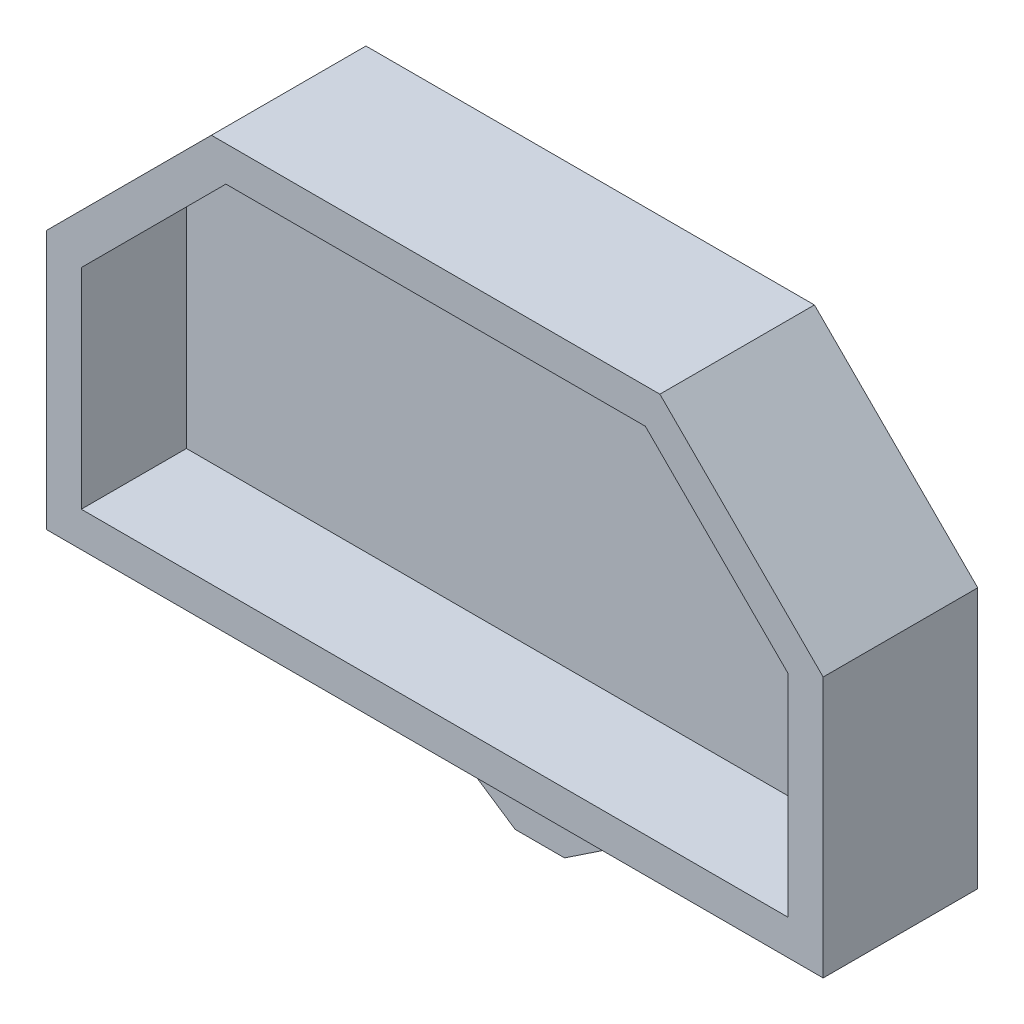
ISO-10303-21;
HEADER;
FILE_DESCRIPTION(('STEP AP214'),'2;1');
FILE_NAME('part.step','',(''),(''),'','','');
FILE_SCHEMA(('AUTOMOTIVE_DESIGN { 1 0 10303 214 1 1 1 1 }'));
ENDSEC;
DATA;
#1=APPLICATION_CONTEXT('core data for automotive mechanical design processes');
#2=APPLICATION_PROTOCOL_DEFINITION('international standard','automotive_design',2000,#1);
#3=PRODUCT_CONTEXT('',#1,'mechanical');
#4=PRODUCT('Part','Part','',(#3));
#5=PRODUCT_RELATED_PRODUCT_CATEGORY('part','',(#4));
#6=PRODUCT_DEFINITION_FORMATION('','',#4);
#7=PRODUCT_DEFINITION_CONTEXT('part definition',#1,'design');
#8=PRODUCT_DEFINITION('design','',#6,#7);
#9=PRODUCT_DEFINITION_SHAPE('','',#8);
#10=(LENGTH_UNIT() NAMED_UNIT(*) SI_UNIT(.MILLI.,.METRE.));
#11=(NAMED_UNIT(*) PLANE_ANGLE_UNIT() SI_UNIT($,.RADIAN.));
#12=(NAMED_UNIT(*) SI_UNIT($,.STERADIAN.) SOLID_ANGLE_UNIT());
#13=UNCERTAINTY_MEASURE_WITH_UNIT(LENGTH_MEASURE(1.E-05),#10,'distance_accuracy_value','');
#14=(GEOMETRIC_REPRESENTATION_CONTEXT(3) GLOBAL_UNCERTAINTY_ASSIGNED_CONTEXT((#13)) GLOBAL_UNIT_ASSIGNED_CONTEXT((#10,
#11,#12)) REPRESENTATION_CONTEXT('',''));
#15=CARTESIAN_POINT('',(0.,0.,0.));
#16=DIRECTION('',(0.,0.,1.));
#17=DIRECTION('',(1.,0.,0.));
#18=AXIS2_PLACEMENT_3D('',#15,#16,#17);
#19=CARTESIAN_POINT('',(10.6544551132229,-2.54,-7.62));
#20=DIRECTION('',(0.,1.,0.));
#21=DIRECTION('',(0.,0.,1.));
#22=AXIS2_PLACEMENT_3D('',#19,#20,#21);
#23=PLANE('',#22);
#24=DIRECTION('',(0.,0.,-1.));
#25=VECTOR('',#24,1.);
#26=CARTESIAN_POINT('',(37.0172951660761,-2.54,-7.62));
#27=LINE('',#26,#25);
#28=CARTESIAN_POINT('',(37.0172951660761,-2.54,-7.62));
#29=VERTEX_POINT('',#28);
#30=CARTESIAN_POINT('',(37.0172951660761,-2.54,-11.2014));
#31=VERTEX_POINT('',#30);
#32=EDGE_CURVE('E181',#29,#31,#27,.T.);
#33=ORIENTED_EDGE('',*,*,#32,.F.);
#34=DIRECTION('',(1.,0.,0.));
#35=VECTOR('',#34,1.);
#36=CARTESIAN_POINT('',(40.5986951660761,-2.54,-7.62));
#37=LINE('',#36,#35);
#38=CARTESIAN_POINT('',(40.5986951660761,-2.54,-7.62));
#39=VERTEX_POINT('',#38);
#40=EDGE_CURVE('E192',#29,#39,#37,.T.);
#41=ORIENTED_EDGE('',*,*,#40,.T.);
#42=DIRECTION('',(0.,0.,-1.));
#43=VECTOR('',#42,1.);
#44=CARTESIAN_POINT('',(40.5986951660761,-2.54,-7.62));
#45=LINE('',#44,#43);
#46=CARTESIAN_POINT('',(40.5986951660761,-2.54,-11.2014));
#47=VERTEX_POINT('',#46);
#48=EDGE_CURVE('E238',#39,#47,#45,.T.);
#49=ORIENTED_EDGE('',*,*,#48,.T.);
#50=DIRECTION('',(-1.,0.,0.));
#51=VECTOR('',#50,1.);
#52=CARTESIAN_POINT('',(10.6544551132229,-2.54,-11.2014));
#53=LINE('',#52,#51);
#54=CARTESIAN_POINT('',(66.9615352189293,-2.54,-11.2014));
#55=VERTEX_POINT('',#54);
#56=EDGE_CURVE('E241',#55,#47,#53,.T.);
#57=ORIENTED_EDGE('',*,*,#56,.F.);
#58=DIRECTION('',(0.,0.,1.));
#59=VECTOR('',#58,1.);
#60=CARTESIAN_POINT('',(66.9615352189293,-2.54,-7.62));
#61=LINE('',#60,#59);
#62=CARTESIAN_POINT('',(66.9615352189293,-2.54,0.));
#63=VERTEX_POINT('',#62);
#64=EDGE_CURVE('E318',#55,#63,#61,.T.);
#65=ORIENTED_EDGE('',*,*,#64,.T.);
#66=DIRECTION('',(-1.,0.,0.));
#67=VECTOR('',#66,1.);
#68=CARTESIAN_POINT('',(10.6544551132229,-2.54,0.));
#69=LINE('',#68,#67);
#70=CARTESIAN_POINT('',(10.6544551132229,-2.54,0.));
#71=VERTEX_POINT('',#70);
#72=EDGE_CURVE('E305',#63,#71,#69,.T.);
#73=ORIENTED_EDGE('',*,*,#72,.T.);
#74=DIRECTION('',(0.,0.,1.));
#75=VECTOR('',#74,1.);
#76=CARTESIAN_POINT('',(10.6544551132229,-2.54,-7.62));
#77=LINE('',#76,#75);
#78=CARTESIAN_POINT('',(10.6544551132229,-2.54,-11.2014));
#79=VERTEX_POINT('',#78);
#80=EDGE_CURVE('E11',#79,#71,#77,.T.);
#81=ORIENTED_EDGE('',*,*,#80,.F.);
#82=EDGE_CURVE('E229',#31,#79,#53,.T.);
#83=ORIENTED_EDGE('',*,*,#82,.F.);
#84=EDGE_LOOP('',(#33,#41,#49,#57,#65,#73,#81,#83));
#85=FACE_BOUND('',#84,.T.);
#86=ADVANCED_FACE('F32',(#85),#23,.F.);
#87=CARTESIAN_POINT('',(0.,0.,0.));
#88=DIRECTION('',(0.,0.,1.));
#89=DIRECTION('',(1.,0.,0.));
#90=AXIS2_PLACEMENT_3D('',#87,#88,#89);
#91=PLANE('',#90);
#92=ORIENTED_EDGE('',*,*,#72,.F.);
#93=DIRECTION('',(0.,-1.,0.));
#94=VECTOR('',#93,1.);
#95=CARTESIAN_POINT('',(66.9615352189293,-2.54,0.));
#96=LINE('',#95,#94);
#97=CARTESIAN_POINT('',(66.9615352189293,16.3516632055388,0.));
#98=VERTEX_POINT('',#97);
#99=EDGE_CURVE('E316',#98,#63,#96,.T.);
#100=ORIENTED_EDGE('',*,*,#99,.F.);
#101=DIRECTION('',(0.707106781186548,-0.707106781186547,0.));
#102=VECTOR('',#101,1.);
#103=CARTESIAN_POINT('',(66.9615352189293,16.3516632055388,0.));
#104=LINE('',#103,#102);
#105=CARTESIAN_POINT('',(55.1266561838001,28.186542240668,0.));
#106=VERTEX_POINT('',#105);
#107=EDGE_CURVE('E314',#106,#98,#104,.T.);
#108=ORIENTED_EDGE('',*,*,#107,.F.);
#109=DIRECTION('',(1.,0.,0.));
#110=VECTOR('',#109,1.);
#111=CARTESIAN_POINT('',(55.1266561838001,28.186542240668,0.));
#112=LINE('',#111,#110);
#113=CARTESIAN_POINT('',(22.6210871379593,28.186542240668,0.));
#114=VERTEX_POINT('',#113);
#115=EDGE_CURVE('E312',#114,#106,#112,.T.);
#116=ORIENTED_EDGE('',*,*,#115,.F.);
#117=DIRECTION('',(0.707106781186548,0.707106781186547,0.));
#118=VECTOR('',#117,1.);
#119=CARTESIAN_POINT('',(22.6210871379593,28.186542240668,0.));
#120=LINE('',#119,#118);
#121=CARTESIAN_POINT('',(10.6544551132229,16.2199102159316,0.));
#122=VERTEX_POINT('',#121);
#123=EDGE_CURVE('E310',#122,#114,#120,.T.);
#124=ORIENTED_EDGE('',*,*,#123,.F.);
#125=DIRECTION('',(0.,1.,0.));
#126=VECTOR('',#125,1.);
#127=CARTESIAN_POINT('',(10.6544551132229,16.2199102159316,0.));
#128=LINE('',#127,#126);
#129=EDGE_CURVE('E308',#71,#122,#128,.T.);
#130=ORIENTED_EDGE('',*,*,#129,.F.);
#131=EDGE_LOOP('',(#92,#100,#108,#116,#124,#130));
#132=FACE_BOUND('',#131,.T.);
#133=DIRECTION('',(0.,-1.,0.));
#134=VECTOR('',#133,1.);
#135=CARTESIAN_POINT('',(64.4215352189293,0.,0.));
#136=LINE('',#135,#134);
#137=CARTESIAN_POINT('',(64.4215352189293,15.2995607571112,0.));
#138=VERTEX_POINT('',#137);
#139=CARTESIAN_POINT('',(64.4215352189293,0.,0.));
#140=VERTEX_POINT('',#139);
#141=EDGE_CURVE('E263',#138,#140,#136,.T.);
#142=ORIENTED_EDGE('',*,*,#141,.T.);
#143=DIRECTION('',(-1.,0.,0.));
#144=VECTOR('',#143,1.);
#145=CARTESIAN_POINT('',(13.1944551132229,0.,0.));
#146=LINE('',#145,#144);
#147=CARTESIAN_POINT('',(13.1944551132229,0.,0.));
#148=VERTEX_POINT('',#147);
#149=EDGE_CURVE('E54',#140,#148,#146,.T.);
#150=ORIENTED_EDGE('',*,*,#149,.T.);
#151=DIRECTION('',(0.,1.,0.));
#152=VECTOR('',#151,1.);
#153=CARTESIAN_POINT('',(13.1944551132229,15.1678077675039,0.));
#154=LINE('',#153,#152);
#155=CARTESIAN_POINT('',(13.1944551132229,15.1678077675039,0.));
#156=VERTEX_POINT('',#155);
#157=EDGE_CURVE('E280',#148,#156,#154,.T.);
#158=ORIENTED_EDGE('',*,*,#157,.T.);
#159=DIRECTION('',(0.707106781186548,0.707106781186548,0.));
#160=VECTOR('',#159,1.);
#161=CARTESIAN_POINT('',(23.6731895863869,25.646542240668,0.));
#162=LINE('',#161,#160);
#163=CARTESIAN_POINT('',(23.6731895863869,25.646542240668,0.));
#164=VERTEX_POINT('',#163);
#165=EDGE_CURVE('E283',#156,#164,#162,.T.);
#166=ORIENTED_EDGE('',*,*,#165,.T.);
#167=DIRECTION('',(1.,0.,0.));
#168=VECTOR('',#167,1.);
#169=CARTESIAN_POINT('',(54.0745537353724,25.646542240668,0.));
#170=LINE('',#169,#168);
#171=CARTESIAN_POINT('',(54.0745537353724,25.646542240668,0.));
#172=VERTEX_POINT('',#171);
#173=EDGE_CURVE('E286',#164,#172,#170,.T.);
#174=ORIENTED_EDGE('',*,*,#173,.T.);
#175=DIRECTION('',(0.707106781186547,-0.707106781186548,0.));
#176=VECTOR('',#175,1.);
#177=CARTESIAN_POINT('',(64.4215352189293,15.2995607571112,0.));
#178=LINE('',#177,#176);
#179=EDGE_CURVE('E289',#172,#138,#178,.T.);
#180=ORIENTED_EDGE('',*,*,#179,.T.);
#181=EDGE_LOOP('',(#142,#150,#158,#166,#174,#180));
#182=FACE_BOUND('',#181,.T.);
#183=ADVANCED_FACE('F339',(#132,#182),#91,.T.);
#184=CARTESIAN_POINT('',(10.6544551132229,16.2199102159316,-7.62));
#185=DIRECTION('',(1.,0.,0.));
#186=DIRECTION('',(0.,0.,-1.));
#187=AXIS2_PLACEMENT_3D('',#184,#185,#186);
#188=PLANE('',#187);
#189=ORIENTED_EDGE('',*,*,#129,.T.);
#190=DIRECTION('',(0.,0.,1.));
#191=VECTOR('',#190,1.);
#192=CARTESIAN_POINT('',(10.6544551132229,16.2199102159316,-7.62));
#193=LINE('',#192,#191);
#194=CARTESIAN_POINT('',(10.6544551132229,16.2199102159316,-11.2014));
#195=VERTEX_POINT('',#194);
#196=EDGE_CURVE('E39',#195,#122,#193,.T.);
#197=ORIENTED_EDGE('',*,*,#196,.F.);
#198=DIRECTION('',(0.,1.,0.));
#199=VECTOR('',#198,1.);
#200=CARTESIAN_POINT('',(10.6544551132229,16.2199102159316,-11.2014));
#201=LINE('',#200,#199);
#202=EDGE_CURVE('E244',#79,#195,#201,.T.);
#203=ORIENTED_EDGE('',*,*,#202,.F.);
#204=ORIENTED_EDGE('',*,*,#80,.T.);
#205=EDGE_LOOP('',(#189,#197,#203,#204));
#206=FACE_BOUND('',#205,.T.);
#207=ADVANCED_FACE('F373',(#206),#188,.F.);
#208=CARTESIAN_POINT('',(22.6210871379593,28.186542240668,-7.62));
#209=DIRECTION('',(0.707106781186547,-0.707106781186548,0.));
#210=DIRECTION('',(0.707106781186548,0.707106781186547,0.));
#211=AXIS2_PLACEMENT_3D('',#208,#209,#210);
#212=PLANE('',#211);
#213=ORIENTED_EDGE('',*,*,#123,.T.);
#214=DIRECTION('',(0.,0.,1.));
#215=VECTOR('',#214,1.);
#216=CARTESIAN_POINT('',(22.6210871379593,28.186542240668,-7.62));
#217=LINE('',#216,#215);
#218=CARTESIAN_POINT('',(22.6210871379593,28.186542240668,-11.2014));
#219=VERTEX_POINT('',#218);
#220=EDGE_CURVE('E327',#219,#114,#217,.T.);
#221=ORIENTED_EDGE('',*,*,#220,.F.);
#222=DIRECTION('',(0.707106781186548,0.707106781186547,0.));
#223=VECTOR('',#222,1.);
#224=CARTESIAN_POINT('',(22.6210871379593,28.186542240668,-11.2014));
#225=LINE('',#224,#223);
#226=EDGE_CURVE('E247',#195,#219,#225,.T.);
#227=ORIENTED_EDGE('',*,*,#226,.F.);
#228=ORIENTED_EDGE('',*,*,#196,.T.);
#229=EDGE_LOOP('',(#213,#221,#227,#228));
#230=FACE_BOUND('',#229,.T.);
#231=ADVANCED_FACE('F333',(#230),#212,.F.);
#232=CARTESIAN_POINT('',(55.1266561838001,28.186542240668,-7.62));
#233=DIRECTION('',(0.,-1.,0.));
#234=DIRECTION('',(0.,0.,-1.));
#235=AXIS2_PLACEMENT_3D('',#232,#233,#234);
#236=PLANE('',#235);
#237=ORIENTED_EDGE('',*,*,#115,.T.);
#238=DIRECTION('',(0.,0.,1.));
#239=VECTOR('',#238,1.);
#240=CARTESIAN_POINT('',(55.1266561838001,28.186542240668,-7.62));
#241=LINE('',#240,#239);
#242=CARTESIAN_POINT('',(55.1266561838001,28.186542240668,-11.2014));
#243=VERTEX_POINT('',#242);
#244=EDGE_CURVE('E324',#243,#106,#241,.T.);
#245=ORIENTED_EDGE('',*,*,#244,.F.);
#246=DIRECTION('',(1.,0.,0.));
#247=VECTOR('',#246,1.);
#248=CARTESIAN_POINT('',(55.1266561838001,28.186542240668,-11.2014));
#249=LINE('',#248,#247);
#250=EDGE_CURVE('E250',#219,#243,#249,.T.);
#251=ORIENTED_EDGE('',*,*,#250,.F.);
#252=ORIENTED_EDGE('',*,*,#220,.T.);
#253=EDGE_LOOP('',(#237,#245,#251,#252));
#254=FACE_BOUND('',#253,.T.);
#255=ADVANCED_FACE('F344',(#254),#236,.F.);
#256=CARTESIAN_POINT('',(66.9615352189293,16.3516632055388,-7.62));
#257=DIRECTION('',(-0.707106781186547,-0.707106781186548,0.));
#258=DIRECTION('',(0.707106781186548,-0.707106781186547,0.));
#259=AXIS2_PLACEMENT_3D('',#256,#257,#258);
#260=PLANE('',#259);
#261=ORIENTED_EDGE('',*,*,#107,.T.);
#262=DIRECTION('',(0.,0.,1.));
#263=VECTOR('',#262,1.);
#264=CARTESIAN_POINT('',(66.9615352189293,16.3516632055388,-7.62));
#265=LINE('',#264,#263);
#266=CARTESIAN_POINT('',(66.9615352189293,16.3516632055388,-11.2014));
#267=VERTEX_POINT('',#266);
#268=EDGE_CURVE('E321',#267,#98,#265,.T.);
#269=ORIENTED_EDGE('',*,*,#268,.F.);
#270=DIRECTION('',(0.707106781186548,-0.707106781186547,0.));
#271=VECTOR('',#270,1.);
#272=CARTESIAN_POINT('',(66.9615352189293,16.3516632055388,-11.2014));
#273=LINE('',#272,#271);
#274=EDGE_CURVE('E253',#243,#267,#273,.T.);
#275=ORIENTED_EDGE('',*,*,#274,.F.);
#276=ORIENTED_EDGE('',*,*,#244,.T.);
#277=EDGE_LOOP('',(#261,#269,#275,#276));
#278=FACE_BOUND('',#277,.T.);
#279=ADVANCED_FACE('F348',(#278),#260,.F.);
#280=CARTESIAN_POINT('',(66.9615352189293,-2.54,-7.62));
#281=DIRECTION('',(-1.,0.,0.));
#282=DIRECTION('',(0.,0.,1.));
#283=AXIS2_PLACEMENT_3D('',#280,#281,#282);
#284=PLANE('',#283);
#285=ORIENTED_EDGE('',*,*,#99,.T.);
#286=ORIENTED_EDGE('',*,*,#64,.F.);
#287=DIRECTION('',(0.,-1.,0.));
#288=VECTOR('',#287,1.);
#289=CARTESIAN_POINT('',(66.9615352189293,-2.54,-11.2014));
#290=LINE('',#289,#288);
#291=EDGE_CURVE('E256',#267,#55,#290,.T.);
#292=ORIENTED_EDGE('',*,*,#291,.F.);
#293=ORIENTED_EDGE('',*,*,#268,.T.);
#294=EDGE_LOOP('',(#285,#286,#292,#293));
#295=FACE_BOUND('',#294,.T.);
#296=ADVANCED_FACE('F354',(#295),#284,.F.);
#297=CARTESIAN_POINT('',(13.1944551132229,0.,-7.62));
#298=DIRECTION('',(0.,1.,0.));
#299=DIRECTION('',(0.,0.,1.));
#300=AXIS2_PLACEMENT_3D('',#297,#298,#299);
#301=PLANE('',#300);
#302=ORIENTED_EDGE('',*,*,#149,.F.);
#303=DIRECTION('',(0.,0.,1.));
#304=VECTOR('',#303,1.);
#305=CARTESIAN_POINT('',(64.4215352189293,0.,-7.62));
#306=LINE('',#305,#304);
#307=CARTESIAN_POINT('',(64.4215352189293,0.,-7.62));
#308=VERTEX_POINT('',#307);
#309=EDGE_CURVE('E278',#308,#140,#306,.T.);
#310=ORIENTED_EDGE('',*,*,#309,.F.);
#311=DIRECTION('',(-1.,0.,0.));
#312=VECTOR('',#311,1.);
#313=CARTESIAN_POINT('',(13.1944551132229,0.,-7.62));
#314=LINE('',#313,#312);
#315=CARTESIAN_POINT('',(13.1944551132229,0.,-7.62));
#316=VERTEX_POINT('',#315);
#317=EDGE_CURVE('E259',#308,#316,#314,.T.);
#318=ORIENTED_EDGE('',*,*,#317,.T.);
#319=DIRECTION('',(0.,0.,1.));
#320=VECTOR('',#319,1.);
#321=CARTESIAN_POINT('',(13.1944551132229,0.,-7.62));
#322=LINE('',#321,#320);
#323=EDGE_CURVE('E303',#316,#148,#322,.T.);
#324=ORIENTED_EDGE('',*,*,#323,.T.);
#325=EDGE_LOOP('',(#302,#310,#318,#324));
#326=FACE_BOUND('',#325,.T.);
#327=ADVANCED_FACE('F430',(#326),#301,.T.);
#328=CARTESIAN_POINT('',(13.1944551132229,15.1678077675039,-7.62));
#329=DIRECTION('',(1.,0.,0.));
#330=DIRECTION('',(0.,0.,-1.));
#331=AXIS2_PLACEMENT_3D('',#328,#329,#330);
#332=PLANE('',#331);
#333=ORIENTED_EDGE('',*,*,#157,.F.);
#334=ORIENTED_EDGE('',*,*,#323,.F.);
#335=DIRECTION('',(0.,1.,0.));
#336=VECTOR('',#335,1.);
#337=CARTESIAN_POINT('',(13.1944551132229,15.1678077675039,-7.62));
#338=LINE('',#337,#336);
#339=CARTESIAN_POINT('',(13.1944551132229,15.1678077675039,-7.62));
#340=VERTEX_POINT('',#339);
#341=EDGE_CURVE('E262',#316,#340,#338,.T.);
#342=ORIENTED_EDGE('',*,*,#341,.T.);
#343=DIRECTION('',(0.,0.,1.));
#344=VECTOR('',#343,1.);
#345=CARTESIAN_POINT('',(13.1944551132229,15.1678077675039,-7.62));
#346=LINE('',#345,#344);
#347=EDGE_CURVE('E301',#340,#156,#346,.T.);
#348=ORIENTED_EDGE('',*,*,#347,.T.);
#349=EDGE_LOOP('',(#333,#334,#342,#348));
#350=FACE_BOUND('',#349,.T.);
#351=ADVANCED_FACE('F441',(#350),#332,.T.);
#352=CARTESIAN_POINT('',(23.6731895863869,25.646542240668,-7.62));
#353=DIRECTION('',(0.707106781186547,-0.707106781186547,0.));
#354=DIRECTION('',(0.707106781186548,0.707106781186548,0.));
#355=AXIS2_PLACEMENT_3D('',#352,#353,#354);
#356=PLANE('',#355);
#357=ORIENTED_EDGE('',*,*,#165,.F.);
#358=ORIENTED_EDGE('',*,*,#347,.F.);
#359=DIRECTION('',(0.707106781186548,0.707106781186548,0.));
#360=VECTOR('',#359,1.);
#361=CARTESIAN_POINT('',(23.6731895863869,25.646542240668,-7.62));
#362=LINE('',#361,#360);
#363=CARTESIAN_POINT('',(23.6731895863869,25.646542240668,-7.62));
#364=VERTEX_POINT('',#363);
#365=EDGE_CURVE('E266',#340,#364,#362,.T.);
#366=ORIENTED_EDGE('',*,*,#365,.T.);
#367=DIRECTION('',(0.,0.,1.));
#368=VECTOR('',#367,1.);
#369=CARTESIAN_POINT('',(23.6731895863869,25.646542240668,-7.62));
#370=LINE('',#369,#368);
#371=EDGE_CURVE('E299',#364,#164,#370,.T.);
#372=ORIENTED_EDGE('',*,*,#371,.T.);
#373=EDGE_LOOP('',(#357,#358,#366,#372));
#374=FACE_BOUND('',#373,.T.);
#375=ADVANCED_FACE('F450',(#374),#356,.T.);
#376=CARTESIAN_POINT('',(54.0745537353724,25.646542240668,-7.62));
#377=DIRECTION('',(0.,-1.,0.));
#378=DIRECTION('',(0.,0.,-1.));
#379=AXIS2_PLACEMENT_3D('',#376,#377,#378);
#380=PLANE('',#379);
#381=ORIENTED_EDGE('',*,*,#173,.F.);
#382=ORIENTED_EDGE('',*,*,#371,.F.);
#383=DIRECTION('',(1.,0.,0.));
#384=VECTOR('',#383,1.);
#385=CARTESIAN_POINT('',(54.0745537353724,25.646542240668,-7.62));
#386=LINE('',#385,#384);
#387=CARTESIAN_POINT('',(54.0745537353724,25.646542240668,-7.62));
#388=VERTEX_POINT('',#387);
#389=EDGE_CURVE('E269',#364,#388,#386,.T.);
#390=ORIENTED_EDGE('',*,*,#389,.T.);
#391=DIRECTION('',(0.,0.,1.));
#392=VECTOR('',#391,1.);
#393=CARTESIAN_POINT('',(54.0745537353724,25.646542240668,-7.62));
#394=LINE('',#393,#392);
#395=EDGE_CURVE('E297',#388,#172,#394,.T.);
#396=ORIENTED_EDGE('',*,*,#395,.T.);
#397=EDGE_LOOP('',(#381,#382,#390,#396));
#398=FACE_BOUND('',#397,.T.);
#399=ADVANCED_FACE('F460',(#398),#380,.T.);
#400=CARTESIAN_POINT('',(64.4215352189293,15.2995607571112,-7.62));
#401=DIRECTION('',(-0.707106781186548,-0.707106781186547,0.));
#402=DIRECTION('',(0.707106781186547,-0.707106781186548,0.));
#403=AXIS2_PLACEMENT_3D('',#400,#401,#402);
#404=PLANE('',#403);
#405=ORIENTED_EDGE('',*,*,#179,.F.);
#406=ORIENTED_EDGE('',*,*,#395,.F.);
#407=DIRECTION('',(0.707106781186547,-0.707106781186548,0.));
#408=VECTOR('',#407,1.);
#409=CARTESIAN_POINT('',(64.4215352189293,15.2995607571112,-7.62));
#410=LINE('',#409,#408);
#411=CARTESIAN_POINT('',(64.4215352189293,15.2995607571112,-7.62));
#412=VERTEX_POINT('',#411);
#413=EDGE_CURVE('E272',#388,#412,#410,.T.);
#414=ORIENTED_EDGE('',*,*,#413,.T.);
#415=DIRECTION('',(0.,0.,1.));
#416=VECTOR('',#415,1.);
#417=CARTESIAN_POINT('',(64.4215352189293,15.2995607571112,-7.62));
#418=LINE('',#417,#416);
#419=EDGE_CURVE('E295',#412,#138,#418,.T.);
#420=ORIENTED_EDGE('',*,*,#419,.T.);
#421=EDGE_LOOP('',(#405,#406,#414,#420));
#422=FACE_BOUND('',#421,.T.);
#423=ADVANCED_FACE('F470',(#422),#404,.T.);
#424=CARTESIAN_POINT('',(64.4215352189293,0.,-7.62));
#425=DIRECTION('',(-1.,0.,0.));
#426=DIRECTION('',(0.,0.,1.));
#427=AXIS2_PLACEMENT_3D('',#424,#425,#426);
#428=PLANE('',#427);
#429=ORIENTED_EDGE('',*,*,#141,.F.);
#430=ORIENTED_EDGE('',*,*,#419,.F.);
#431=DIRECTION('',(0.,-1.,0.));
#432=VECTOR('',#431,1.);
#433=CARTESIAN_POINT('',(64.4215352189293,0.,-7.62));
#434=LINE('',#433,#432);
#435=EDGE_CURVE('E275',#412,#308,#434,.T.);
#436=ORIENTED_EDGE('',*,*,#435,.T.);
#437=ORIENTED_EDGE('',*,*,#309,.T.);
#438=EDGE_LOOP('',(#429,#430,#436,#437));
#439=FACE_BOUND('',#438,.T.);
#440=ADVANCED_FACE('F480',(#439),#428,.T.);
#441=CARTESIAN_POINT('',(0.,0.,-7.62));
#442=DIRECTION('',(0.,0.,1.));
#443=DIRECTION('',(1.,0.,0.));
#444=AXIS2_PLACEMENT_3D('',#441,#442,#443);
#445=PLANE('',#444);
#446=ORIENTED_EDGE('',*,*,#317,.F.);
#447=ORIENTED_EDGE('',*,*,#435,.F.);
#448=ORIENTED_EDGE('',*,*,#413,.F.);
#449=ORIENTED_EDGE('',*,*,#389,.F.);
#450=ORIENTED_EDGE('',*,*,#365,.F.);
#451=ORIENTED_EDGE('',*,*,#341,.F.);
#452=EDGE_LOOP('',(#446,#447,#448,#449,#450,#451));
#453=FACE_BOUND('',#452,.T.);
#454=ADVANCED_FACE('F488',(#453),#445,.T.);
#455=CARTESIAN_POINT('',(0.,0.,-11.2014));
#456=DIRECTION('',(0.,0.,1.));
#457=DIRECTION('',(1.,0.,0.));
#458=AXIS2_PLACEMENT_3D('',#455,#456,#457);
#459=PLANE('',#458);
#460=ORIENTED_EDGE('',*,*,#56,.T.);
#461=DIRECTION('',(0.,-1.,0.));
#462=VECTOR('',#461,1.);
#463=CARTESIAN_POINT('',(40.5986951660761,-2.54,-11.2014));
#464=LINE('',#463,#462);
#465=CARTESIAN_POINT('',(40.5986951660761,-6.9149976,-11.2014));
#466=VERTEX_POINT('',#465);
#467=EDGE_CURVE('E46',#47,#466,#464,.T.);
#468=ORIENTED_EDGE('',*,*,#467,.T.);
#469=DIRECTION('',(1.,0.,0.));
#470=VECTOR('',#469,1.);
#471=CARTESIAN_POINT('',(40.5986951660761,-6.9149976,-11.2014));
#472=LINE('',#471,#470);
#473=CARTESIAN_POINT('',(48.2059951660761,-6.9149976,-11.2014));
#474=VERTEX_POINT('',#473);
#475=EDGE_CURVE('E220',#466,#474,#472,.T.);
#476=ORIENTED_EDGE('',*,*,#475,.T.);
#477=DIRECTION('',(-0.831622862362015,-0.55534080959066,0.));
#478=VECTOR('',#477,1.);
#479=CARTESIAN_POINT('',(48.2059951660761,-6.9149976,-11.2014));
#480=LINE('',#479,#478);
#481=CARTESIAN_POINT('',(40.5986951660761,-11.9949976,-11.2014));
#482=VERTEX_POINT('',#481);
#483=EDGE_CURVE('E223',#474,#482,#480,.T.);
#484=ORIENTED_EDGE('',*,*,#483,.T.);
#485=DIRECTION('',(-1.,0.,0.));
#486=VECTOR('',#485,1.);
#487=CARTESIAN_POINT('',(40.5986951660761,-11.9949976,-11.2014));
#488=LINE('',#487,#486);
#489=CARTESIAN_POINT('',(37.0172951660761,-11.9949976,-11.2014));
#490=VERTEX_POINT('',#489);
#491=EDGE_CURVE('E199',#482,#490,#488,.T.);
#492=ORIENTED_EDGE('',*,*,#491,.T.);
#493=DIRECTION('',(-0.831622862362014,0.555340809590661,0.));
#494=VECTOR('',#493,1.);
#495=CARTESIAN_POINT('',(37.0172951660761,-11.9949976,-11.2014));
#496=LINE('',#495,#494);
#497=CARTESIAN_POINT('',(29.4099951660761,-6.9149976,-11.2014));
#498=VERTEX_POINT('',#497);
#499=EDGE_CURVE('E196',#490,#498,#496,.T.);
#500=ORIENTED_EDGE('',*,*,#499,.T.);
#501=DIRECTION('',(1.,0.,0.));
#502=VECTOR('',#501,1.);
#503=CARTESIAN_POINT('',(29.4099951660761,-6.9149976,-11.2014));
#504=LINE('',#503,#502);
#505=CARTESIAN_POINT('',(37.0172951660761,-6.9149976,-11.2014));
#506=VERTEX_POINT('',#505);
#507=EDGE_CURVE('E216',#498,#506,#504,.T.);
#508=ORIENTED_EDGE('',*,*,#507,.T.);
#509=DIRECTION('',(0.,1.,0.));
#510=VECTOR('',#509,1.);
#511=CARTESIAN_POINT('',(37.0172951660761,-2.54,-11.2014));
#512=LINE('',#511,#510);
#513=EDGE_CURVE('E176',#506,#31,#512,.T.);
#514=ORIENTED_EDGE('',*,*,#513,.T.);
#515=ORIENTED_EDGE('',*,*,#82,.T.);
#516=ORIENTED_EDGE('',*,*,#202,.T.);
#517=ORIENTED_EDGE('',*,*,#226,.T.);
#518=ORIENTED_EDGE('',*,*,#250,.T.);
#519=ORIENTED_EDGE('',*,*,#274,.T.);
#520=ORIENTED_EDGE('',*,*,#291,.T.);
#521=EDGE_LOOP('',(#460,#468,#476,#484,#492,#500,#508,#514,#515,#516,#517,#518,#519,#520));
#522=FACE_BOUND('',#521,.T.);
#523=ADVANCED_FACE('F351',(#522),#459,.F.);
#524=CARTESIAN_POINT('',(29.4099951660761,-6.9149976,-7.62));
#525=DIRECTION('',(0.,1.,0.));
#526=DIRECTION('',(-1.,0.,0.));
#527=AXIS2_PLACEMENT_3D('',#524,#525,#526);
#528=PLANE('',#527);
#529=ORIENTED_EDGE('',*,*,#507,.F.);
#530=DIRECTION('',(0.,0.,-1.));
#531=VECTOR('',#530,1.);
#532=CARTESIAN_POINT('',(29.4099951660761,-6.9149976,-7.62));
#533=LINE('',#532,#531);
#534=CARTESIAN_POINT('',(29.4099951660761,-6.9149976,-7.62));
#535=VERTEX_POINT('',#534);
#536=EDGE_CURVE('E195',#535,#498,#533,.T.);
#537=ORIENTED_EDGE('',*,*,#536,.F.);
#538=DIRECTION('',(1.,0.,0.));
#539=VECTOR('',#538,1.);
#540=CARTESIAN_POINT('',(29.4099951660761,-6.9149976,-7.62));
#541=LINE('',#540,#539);
#542=CARTESIAN_POINT('',(37.0172951660761,-6.9149976,-7.62));
#543=VERTEX_POINT('',#542);
#544=EDGE_CURVE('E188',#535,#543,#541,.T.);
#545=ORIENTED_EDGE('',*,*,#544,.T.);
#546=DIRECTION('',(0.,0.,-1.));
#547=VECTOR('',#546,1.);
#548=CARTESIAN_POINT('',(37.0172951660761,-6.9149976,-7.62));
#549=LINE('',#548,#547);
#550=EDGE_CURVE('E170',#543,#506,#549,.T.);
#551=ORIENTED_EDGE('',*,*,#550,.T.);
#552=EDGE_LOOP('',(#529,#537,#545,#551));
#553=FACE_BOUND('',#552,.T.);
#554=ADVANCED_FACE('F194',(#553),#528,.T.);
#555=CARTESIAN_POINT('',(37.0172951660761,-11.9949976,-7.62));
#556=DIRECTION('',(-0.555340809590661,-0.831622862362014,0.));
#557=DIRECTION('',(0.831622862362014,-0.555340809590661,0.));
#558=AXIS2_PLACEMENT_3D('',#555,#556,#557);
#559=PLANE('',#558);
#560=ORIENTED_EDGE('',*,*,#499,.F.);
#561=DIRECTION('',(0.,0.,-1.));
#562=VECTOR('',#561,1.);
#563=CARTESIAN_POINT('',(37.0172951660761,-11.9949976,-7.62));
#564=LINE('',#563,#562);
#565=CARTESIAN_POINT('',(37.0172951660761,-11.9949976,-7.62));
#566=VERTEX_POINT('',#565);
#567=EDGE_CURVE('E230',#566,#490,#564,.T.);
#568=ORIENTED_EDGE('',*,*,#567,.F.);
#569=DIRECTION('',(-0.831622862362014,0.555340809590661,0.));
#570=VECTOR('',#569,1.);
#571=CARTESIAN_POINT('',(37.0172951660761,-11.9949976,-7.62));
#572=LINE('',#571,#570);
#573=EDGE_CURVE('E182',#566,#535,#572,.T.);
#574=ORIENTED_EDGE('',*,*,#573,.T.);
#575=ORIENTED_EDGE('',*,*,#536,.T.);
#576=EDGE_LOOP('',(#560,#568,#574,#575));
#577=FACE_BOUND('',#576,.T.);
#578=ADVANCED_FACE('F371',(#577),#559,.T.);
#579=CARTESIAN_POINT('',(40.5986951660761,-11.9949976,-7.62));
#580=DIRECTION('',(0.,-1.,0.));
#581=DIRECTION('',(1.,0.,0.));
#582=AXIS2_PLACEMENT_3D('',#579,#580,#581);
#583=PLANE('',#582);
#584=ORIENTED_EDGE('',*,*,#491,.F.);
#585=DIRECTION('',(0.,0.,-1.));
#586=VECTOR('',#585,1.);
#587=CARTESIAN_POINT('',(40.5986951660761,-11.9949976,-7.62));
#588=LINE('',#587,#586);
#589=CARTESIAN_POINT('',(40.5986951660761,-11.9949976,-7.62));
#590=VERTEX_POINT('',#589);
#591=EDGE_CURVE('E232',#590,#482,#588,.T.);
#592=ORIENTED_EDGE('',*,*,#591,.F.);
#593=DIRECTION('',(-1.,0.,0.));
#594=VECTOR('',#593,1.);
#595=CARTESIAN_POINT('',(40.5986951660761,-11.9949976,-7.62));
#596=LINE('',#595,#594);
#597=EDGE_CURVE('E212',#590,#566,#596,.T.);
#598=ORIENTED_EDGE('',*,*,#597,.T.);
#599=ORIENTED_EDGE('',*,*,#567,.T.);
#600=EDGE_LOOP('',(#584,#592,#598,#599));
#601=FACE_BOUND('',#600,.T.);
#602=ADVANCED_FACE('F368',(#601),#583,.T.);
#603=CARTESIAN_POINT('',(48.2059951660761,-6.9149976,-7.62));
#604=DIRECTION('',(0.55534080959066,-0.831622862362015,0.));
#605=DIRECTION('',(0.831622862362015,0.55534080959066,0.));
#606=AXIS2_PLACEMENT_3D('',#603,#604,#605);
#607=PLANE('',#606);
#608=ORIENTED_EDGE('',*,*,#483,.F.);
#609=DIRECTION('',(0.,0.,-1.));
#610=VECTOR('',#609,1.);
#611=CARTESIAN_POINT('',(48.2059951660761,-6.9149976,-7.62));
#612=LINE('',#611,#610);
#613=CARTESIAN_POINT('',(48.2059951660761,-6.9149976,-7.62));
#614=VERTEX_POINT('',#613);
#615=EDGE_CURVE('E234',#614,#474,#612,.T.);
#616=ORIENTED_EDGE('',*,*,#615,.F.);
#617=DIRECTION('',(-0.831622862362015,-0.55534080959066,0.));
#618=VECTOR('',#617,1.);
#619=CARTESIAN_POINT('',(48.2059951660761,-6.9149976,-7.62));
#620=LINE('',#619,#618);
#621=EDGE_CURVE('E209',#614,#590,#620,.T.);
#622=ORIENTED_EDGE('',*,*,#621,.T.);
#623=ORIENTED_EDGE('',*,*,#591,.T.);
#624=EDGE_LOOP('',(#608,#616,#622,#623));
#625=FACE_BOUND('',#624,.T.);
#626=ADVANCED_FACE('F364',(#625),#607,.T.);
#627=CARTESIAN_POINT('',(40.5986951660761,-6.9149976,-7.62));
#628=DIRECTION('',(0.,1.,0.));
#629=DIRECTION('',(-1.,0.,0.));
#630=AXIS2_PLACEMENT_3D('',#627,#628,#629);
#631=PLANE('',#630);
#632=ORIENTED_EDGE('',*,*,#475,.F.);
#633=DIRECTION('',(0.,0.,-1.));
#634=VECTOR('',#633,1.);
#635=CARTESIAN_POINT('',(40.5986951660761,-6.9149976,-7.62));
#636=LINE('',#635,#634);
#637=CARTESIAN_POINT('',(40.5986951660761,-6.9149976,-7.62));
#638=VERTEX_POINT('',#637);
#639=EDGE_CURVE('E236',#638,#466,#636,.T.);
#640=ORIENTED_EDGE('',*,*,#639,.F.);
#641=DIRECTION('',(1.,0.,0.));
#642=VECTOR('',#641,1.);
#643=CARTESIAN_POINT('',(40.5986951660761,-6.9149976,-7.62));
#644=LINE('',#643,#642);
#645=EDGE_CURVE('E206',#638,#614,#644,.T.);
#646=ORIENTED_EDGE('',*,*,#645,.T.);
#647=ORIENTED_EDGE('',*,*,#615,.T.);
#648=EDGE_LOOP('',(#632,#640,#646,#647));
#649=FACE_BOUND('',#648,.T.);
#650=ADVANCED_FACE('F360',(#649),#631,.T.);
#651=CARTESIAN_POINT('',(40.5986951660761,-2.54,-7.62));
#652=DIRECTION('',(1.,0.,0.));
#653=DIRECTION('',(0.,0.,-1.));
#654=AXIS2_PLACEMENT_3D('',#651,#652,#653);
#655=PLANE('',#654);
#656=ORIENTED_EDGE('',*,*,#467,.F.);
#657=ORIENTED_EDGE('',*,*,#48,.F.);
#658=DIRECTION('',(0.,-1.,0.));
#659=VECTOR('',#658,1.);
#660=CARTESIAN_POINT('',(40.5986951660761,-2.54,-7.62));
#661=LINE('',#660,#659);
#662=EDGE_CURVE('E203',#39,#638,#661,.T.);
#663=ORIENTED_EDGE('',*,*,#662,.T.);
#664=ORIENTED_EDGE('',*,*,#639,.T.);
#665=EDGE_LOOP('',(#656,#657,#663,#664));
#666=FACE_BOUND('',#665,.T.);
#667=ADVANCED_FACE('F535',(#666),#655,.T.);
#668=CARTESIAN_POINT('',(37.0172951660761,-2.54,-7.62));
#669=DIRECTION('',(-1.,0.,0.));
#670=DIRECTION('',(0.,0.,1.));
#671=AXIS2_PLACEMENT_3D('',#668,#669,#670);
#672=PLANE('',#671);
#673=ORIENTED_EDGE('',*,*,#513,.F.);
#674=ORIENTED_EDGE('',*,*,#550,.F.);
#675=DIRECTION('',(0.,1.,0.));
#676=VECTOR('',#675,1.);
#677=CARTESIAN_POINT('',(37.0172951660761,-2.54,-7.62));
#678=LINE('',#677,#676);
#679=EDGE_CURVE('E173',#543,#29,#678,.T.);
#680=ORIENTED_EDGE('',*,*,#679,.T.);
#681=ORIENTED_EDGE('',*,*,#32,.T.);
#682=EDGE_LOOP('',(#673,#674,#680,#681));
#683=FACE_BOUND('',#682,.T.);
#684=ADVANCED_FACE('F172',(#683),#672,.T.);
#685=CARTESIAN_POINT('',(0.,0.,-7.62));
#686=DIRECTION('',(0.,0.,-1.));
#687=DIRECTION('',(-1.,0.,0.));
#688=AXIS2_PLACEMENT_3D('',#685,#686,#687);
#689=PLANE('',#688);
#690=ORIENTED_EDGE('',*,*,#544,.F.);
#691=ORIENTED_EDGE('',*,*,#573,.F.);
#692=ORIENTED_EDGE('',*,*,#597,.F.);
#693=ORIENTED_EDGE('',*,*,#621,.F.);
#694=ORIENTED_EDGE('',*,*,#645,.F.);
#695=ORIENTED_EDGE('',*,*,#662,.F.);
#696=ORIENTED_EDGE('',*,*,#40,.F.);
#697=ORIENTED_EDGE('',*,*,#679,.F.);
#698=EDGE_LOOP('',(#690,#691,#692,#693,#694,#695,#696,#697));
#699=FACE_BOUND('',#698,.T.);
#700=ADVANCED_FACE('F186',(#699),#689,.F.);
#701=CLOSED_SHELL('',(#86,#183,#207,#231,#255,#279,#296,#327,#351,#375,#399,#423,#440,#454,#523,
#554,#578,#602,#626,#650,#667,#684,#700));
#702=MANIFOLD_SOLID_BREP('B2',#701);
#703=ADVANCED_BREP_SHAPE_REPRESENTATION('',(#18,#702),#14);
#704=SHAPE_DEFINITION_REPRESENTATION(#9,#703);
ENDSEC;
END-ISO-10303-21;
